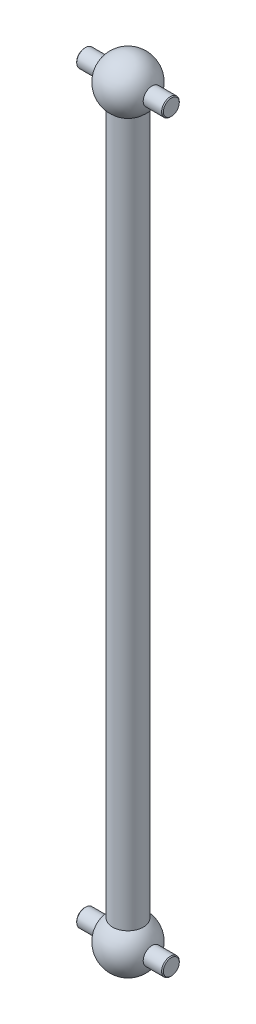
ISO-10303-21;
HEADER;
FILE_DESCRIPTION(('STEP AP214'),'2;1');
FILE_NAME('part.step','',(''),(''),'','','');
FILE_SCHEMA(('AUTOMOTIVE_DESIGN { 1 0 10303 214 1 1 1 1 }'));
ENDSEC;
DATA;
#1=APPLICATION_CONTEXT('core data for automotive mechanical design processes');
#2=APPLICATION_PROTOCOL_DEFINITION('international standard','automotive_design',2000,#1);
#3=PRODUCT_CONTEXT('',#1,'mechanical');
#4=PRODUCT('Part','Part','',(#3));
#5=PRODUCT_RELATED_PRODUCT_CATEGORY('part','',(#4));
#6=PRODUCT_DEFINITION_FORMATION('','',#4);
#7=PRODUCT_DEFINITION_CONTEXT('part definition',#1,'design');
#8=PRODUCT_DEFINITION('design','',#6,#7);
#9=PRODUCT_DEFINITION_SHAPE('','',#8);
#10=(LENGTH_UNIT() NAMED_UNIT(*) SI_UNIT(.MILLI.,.METRE.));
#11=(NAMED_UNIT(*) PLANE_ANGLE_UNIT() SI_UNIT($,.RADIAN.));
#12=(NAMED_UNIT(*) SI_UNIT($,.STERADIAN.) SOLID_ANGLE_UNIT());
#13=UNCERTAINTY_MEASURE_WITH_UNIT(LENGTH_MEASURE(1.E-05),#10,'distance_accuracy_value','');
#14=(GEOMETRIC_REPRESENTATION_CONTEXT(3) GLOBAL_UNCERTAINTY_ASSIGNED_CONTEXT((#13)) GLOBAL_UNIT_ASSIGNED_CONTEXT((#10,
#11,#12)) REPRESENTATION_CONTEXT('',''));
#15=CARTESIAN_POINT('',(0.,0.,0.));
#16=DIRECTION('',(0.,0.,1.));
#17=DIRECTION('',(1.,0.,0.));
#18=AXIS2_PLACEMENT_3D('',#15,#16,#17);
#19=CARTESIAN_POINT('',(0.,-42.1,0.));
#20=DIRECTION('',(0.,1.,0.));
#21=DIRECTION('',(-1.,0.,0.));
#22=AXIS2_PLACEMENT_3D('',#19,#20,#21);
#23=SPHERICAL_SURFACE('',#22,2.9);
#24=CARTESIAN_POINT('',(-2.72213151776324,-42.1,0.));
#25=DIRECTION('',(1.,0.,0.));
#26=DIRECTION('',(0.,0.,-1.));
#27=AXIS2_PLACEMENT_3D('',#24,#25,#26);
#28=CIRCLE('',#27,1.);
#29=CARTESIAN_POINT('',(-2.72213151776324,-42.1,-1.));
#30=VERTEX_POINT('',#29);
#31=EDGE_CURVE('E67',#30,#30,#28,.T.);
#32=ORIENTED_EDGE('',*,*,#31,.T.);
#33=EDGE_LOOP('',(#32));
#34=FACE_BOUND('',#33,.T.);
#35=CARTESIAN_POINT('',(0.,-39.7875337840306,0.));
#36=DIRECTION('',(0.,1.,0.));
#37=DIRECTION('',(0.,0.,1.));
#38=AXIS2_PLACEMENT_3D('',#35,#36,#37);
#39=CIRCLE('',#38,1.75);
#40=CARTESIAN_POINT('',(0.,-39.7875337840306,1.75));
#41=VERTEX_POINT('',#40);
#42=EDGE_CURVE('E66',#41,#41,#39,.T.);
#43=ORIENTED_EDGE('',*,*,#42,.F.);
#44=EDGE_LOOP('',(#43));
#45=FACE_BOUND('',#44,.T.);
#46=CARTESIAN_POINT('',(2.72213151776324,-42.1,0.));
#47=DIRECTION('',(-1.,0.,0.));
#48=DIRECTION('',(0.,0.,1.));
#49=AXIS2_PLACEMENT_3D('',#46,#47,#48);
#50=CIRCLE('',#49,1.);
#51=CARTESIAN_POINT('',(2.72213151776324,-42.1,1.));
#52=VERTEX_POINT('',#51);
#53=EDGE_CURVE('E63',#52,#52,#50,.T.);
#54=ORIENTED_EDGE('',*,*,#53,.T.);
#55=EDGE_LOOP('',(#54));
#56=FACE_BOUND('',#55,.T.);
#57=ADVANCED_FACE('F30',(#34,#45,#56),#23,.T.);
#58=CARTESIAN_POINT('',(0.,42.1,0.));
#59=DIRECTION('',(0.,1.,0.));
#60=DIRECTION('',(1.,0.,0.));
#61=AXIS2_PLACEMENT_3D('',#58,#59,#60);
#62=SPHERICAL_SURFACE('',#61,2.9);
#63=CARTESIAN_POINT('',(2.72213151776324,42.1,0.));
#64=DIRECTION('',(-1.,0.,0.));
#65=DIRECTION('',(0.,0.,1.));
#66=AXIS2_PLACEMENT_3D('',#63,#64,#65);
#67=CIRCLE('',#66,1.);
#68=CARTESIAN_POINT('',(2.72213151776324,42.1,1.));
#69=VERTEX_POINT('',#68);
#70=EDGE_CURVE('E62',#69,#69,#67,.F.);
#71=ORIENTED_EDGE('',*,*,#70,.F.);
#72=EDGE_LOOP('',(#71));
#73=FACE_BOUND('',#72,.T.);
#74=CARTESIAN_POINT('',(-2.72213151776324,42.1,0.));
#75=DIRECTION('',(1.,0.,0.));
#76=DIRECTION('',(0.,0.,-1.));
#77=AXIS2_PLACEMENT_3D('',#74,#75,#76);
#78=CIRCLE('',#77,1.);
#79=CARTESIAN_POINT('',(-2.72213151776324,42.1,-1.));
#80=VERTEX_POINT('',#79);
#81=EDGE_CURVE('E72',#80,#80,#78,.F.);
#82=ORIENTED_EDGE('',*,*,#81,.F.);
#83=EDGE_LOOP('',(#82));
#84=FACE_BOUND('',#83,.T.);
#85=CARTESIAN_POINT('',(0.,39.7875337840306,0.));
#86=DIRECTION('',(0.,1.,0.));
#87=DIRECTION('',(0.,0.,1.));
#88=AXIS2_PLACEMENT_3D('',#85,#86,#87);
#89=CIRCLE('',#88,1.75);
#90=CARTESIAN_POINT('',(0.,39.7875337840306,1.75));
#91=VERTEX_POINT('',#90);
#92=EDGE_CURVE('E75',#91,#91,#89,.T.);
#93=ORIENTED_EDGE('',*,*,#92,.T.);
#94=EDGE_LOOP('',(#93));
#95=FACE_BOUND('',#94,.T.);
#96=ADVANCED_FACE('F86',(#73,#84,#95),#62,.T.);
#97=CARTESIAN_POINT('',(0.,45.,0.));
#98=DIRECTION('',(0.,1.,0.));
#99=DIRECTION('',(0.,0.,1.));
#100=AXIS2_PLACEMENT_3D('',#97,#98,#99);
#101=CYLINDRICAL_SURFACE('',#100,1.75);
#102=ORIENTED_EDGE('',*,*,#42,.T.);
#103=EDGE_LOOP('',(#102));
#104=FACE_BOUND('',#103,.T.);
#105=ORIENTED_EDGE('',*,*,#92,.F.);
#106=EDGE_LOOP('',(#105));
#107=FACE_BOUND('',#106,.T.);
#108=ADVANCED_FACE('F81',(#104,#107),#101,.T.);
#109=CARTESIAN_POINT('',(-4.9,42.1,0.));
#110=DIRECTION('',(1.,0.,0.));
#111=DIRECTION('',(0.,0.,-1.));
#112=AXIS2_PLACEMENT_3D('',#109,#110,#111);
#113=PLANE('',#112);
#114=CARTESIAN_POINT('',(-4.9,42.1,0.));
#115=DIRECTION('',(1.,0.,0.));
#116=DIRECTION('',(0.,0.,-1.));
#117=AXIS2_PLACEMENT_3D('',#114,#115,#116);
#118=CIRCLE('',#117,0.899999999999998);
#119=CARTESIAN_POINT('',(-4.9,42.1,-0.899999999999998));
#120=VERTEX_POINT('',#119);
#121=EDGE_CURVE('E10',#120,#120,#118,.F.);
#122=ORIENTED_EDGE('',*,*,#121,.T.);
#123=EDGE_LOOP('',(#122));
#124=FACE_BOUND('',#123,.T.);
#125=ADVANCED_FACE('F113',(#124),#113,.F.);
#126=CARTESIAN_POINT('',(-4.9,42.1,0.));
#127=DIRECTION('',(1.,0.,0.));
#128=DIRECTION('',(0.,0.,-1.));
#129=AXIS2_PLACEMENT_3D('',#126,#127,#128);
#130=CYLINDRICAL_SURFACE('',#129,1.);
#131=CARTESIAN_POINT('',(-4.79999999999999,42.1,0.));
#132=DIRECTION('',(1.,0.,0.));
#133=DIRECTION('',(0.,0.,-1.));
#134=AXIS2_PLACEMENT_3D('',#131,#132,#133);
#135=CIRCLE('',#134,1.);
#136=CARTESIAN_POINT('',(-4.79999999999999,42.1,-1.));
#137=VERTEX_POINT('',#136);
#138=EDGE_CURVE('E37',#137,#137,#135,.T.);
#139=ORIENTED_EDGE('',*,*,#138,.T.);
#140=EDGE_LOOP('',(#139));
#141=FACE_BOUND('',#140,.T.);
#142=ORIENTED_EDGE('',*,*,#81,.T.);
#143=EDGE_LOOP('',(#142));
#144=FACE_BOUND('',#143,.T.);
#145=ADVANCED_FACE('F116',(#141,#144),#130,.T.);
#146=CARTESIAN_POINT('',(4.79999999999999,42.1,0.));
#147=DIRECTION('',(1.,0.,0.));
#148=DIRECTION('',(0.,0.,-1.));
#149=AXIS2_PLACEMENT_3D('',#146,#147,#148);
#150=CIRCLE('',#149,1.);
#151=CARTESIAN_POINT('',(4.79999999999999,42.1,-1.));
#152=VERTEX_POINT('',#151);
#153=EDGE_CURVE('E41',#152,#152,#150,.F.);
#154=ORIENTED_EDGE('',*,*,#153,.T.);
#155=EDGE_LOOP('',(#154));
#156=FACE_BOUND('',#155,.T.);
#157=ORIENTED_EDGE('',*,*,#70,.T.);
#158=EDGE_LOOP('',(#157));
#159=FACE_BOUND('',#158,.T.);
#160=ADVANCED_FACE('F111',(#156,#159),#130,.T.);
#161=CARTESIAN_POINT('',(4.9,42.1,0.));
#162=DIRECTION('',(1.,0.,0.));
#163=DIRECTION('',(0.,0.,-1.));
#164=AXIS2_PLACEMENT_3D('',#161,#162,#163);
#165=PLANE('',#164);
#166=CARTESIAN_POINT('',(4.9,42.1,0.));
#167=DIRECTION('',(1.,0.,0.));
#168=DIRECTION('',(0.,0.,-1.));
#169=AXIS2_PLACEMENT_3D('',#166,#167,#168);
#170=CIRCLE('',#169,0.899999999999998);
#171=CARTESIAN_POINT('',(4.9,42.1,-0.899999999999998));
#172=VERTEX_POINT('',#171);
#173=EDGE_CURVE('E45',#172,#172,#170,.T.);
#174=ORIENTED_EDGE('',*,*,#173,.T.);
#175=EDGE_LOOP('',(#174));
#176=FACE_BOUND('',#175,.T.);
#177=ADVANCED_FACE('F108',(#176),#165,.T.);
#178=CARTESIAN_POINT('',(-4.9,-42.1,0.));
#179=DIRECTION('',(1.,0.,0.));
#180=DIRECTION('',(0.,0.,-1.));
#181=AXIS2_PLACEMENT_3D('',#178,#179,#180);
#182=PLANE('',#181);
#183=CARTESIAN_POINT('',(-4.9,-42.1,0.));
#184=DIRECTION('',(1.,0.,0.));
#185=DIRECTION('',(0.,0.,-1.));
#186=AXIS2_PLACEMENT_3D('',#183,#184,#185);
#187=CIRCLE('',#186,0.899999999999998);
#188=CARTESIAN_POINT('',(-4.9,-42.1,-0.899999999999998));
#189=VERTEX_POINT('',#188);
#190=EDGE_CURVE('E53',#189,#189,#187,.F.);
#191=ORIENTED_EDGE('',*,*,#190,.T.);
#192=EDGE_LOOP('',(#191));
#193=FACE_BOUND('',#192,.T.);
#194=ADVANCED_FACE('F104',(#193),#182,.F.);
#195=CARTESIAN_POINT('',(-4.9,-42.1,0.));
#196=DIRECTION('',(1.,0.,0.));
#197=DIRECTION('',(0.,0.,-1.));
#198=AXIS2_PLACEMENT_3D('',#195,#196,#197);
#199=CYLINDRICAL_SURFACE('',#198,1.);
#200=CARTESIAN_POINT('',(-4.79999999999999,-42.1,0.));
#201=DIRECTION('',(1.,0.,0.));
#202=DIRECTION('',(0.,0.,-1.));
#203=AXIS2_PLACEMENT_3D('',#200,#201,#202);
#204=CIRCLE('',#203,1.);
#205=CARTESIAN_POINT('',(-4.79999999999999,-42.1,-1.));
#206=VERTEX_POINT('',#205);
#207=EDGE_CURVE('E50',#206,#206,#204,.T.);
#208=ORIENTED_EDGE('',*,*,#207,.T.);
#209=EDGE_LOOP('',(#208));
#210=FACE_BOUND('',#209,.T.);
#211=ORIENTED_EDGE('',*,*,#31,.F.);
#212=EDGE_LOOP('',(#211));
#213=FACE_BOUND('',#212,.T.);
#214=ADVANCED_FACE('F94',(#210,#213),#199,.T.);
#215=CARTESIAN_POINT('',(4.80000000000001,-42.1,0.));
#216=DIRECTION('',(1.,0.,0.));
#217=DIRECTION('',(0.,0.,-1.));
#218=AXIS2_PLACEMENT_3D('',#215,#216,#217);
#219=CIRCLE('',#218,1.);
#220=CARTESIAN_POINT('',(4.80000000000001,-42.1,1.));
#221=VERTEX_POINT('',#220);
#222=EDGE_CURVE('E59',#221,#221,#219,.F.);
#223=ORIENTED_EDGE('',*,*,#222,.T.);
#224=EDGE_LOOP('',(#223));
#225=FACE_BOUND('',#224,.T.);
#226=ORIENTED_EDGE('',*,*,#53,.F.);
#227=EDGE_LOOP('',(#226));
#228=FACE_BOUND('',#227,.T.);
#229=ADVANCED_FACE('F91',(#225,#228),#199,.T.);
#230=CARTESIAN_POINT('',(4.9,-42.1,0.));
#231=DIRECTION('',(1.,0.,0.));
#232=DIRECTION('',(0.,0.,-1.));
#233=AXIS2_PLACEMENT_3D('',#230,#231,#232);
#234=PLANE('',#233);
#235=CARTESIAN_POINT('',(4.9,-42.1,0.));
#236=DIRECTION('',(1.,0.,0.));
#237=DIRECTION('',(0.,0.,-1.));
#238=AXIS2_PLACEMENT_3D('',#235,#236,#237);
#239=CIRCLE('',#238,0.900000000000012);
#240=CARTESIAN_POINT('',(4.9,-42.1,0.900000000000012));
#241=VERTEX_POINT('',#240);
#242=EDGE_CURVE('E56',#241,#241,#239,.T.);
#243=ORIENTED_EDGE('',*,*,#242,.T.);
#244=EDGE_LOOP('',(#243));
#245=FACE_BOUND('',#244,.T.);
#246=ADVANCED_FACE('F93',(#245),#234,.T.);
#247=CARTESIAN_POINT('',(4.80000000000001,-42.1,0.));
#248=DIRECTION('',(-1.,0.,0.));
#249=DIRECTION('',(0.,0.,1.));
#250=AXIS2_PLACEMENT_3D('',#247,#248,#249);
#251=CONICAL_SURFACE('',#250,1.,0.78539816339743);
#252=CARTESIAN_POINT('',(4.9,-42.1,0.900000000000012));
#253=CARTESIAN_POINT('',(4.89895833333333,-42.1,0.901041666666679));
#254=CARTESIAN_POINT('',(4.89791666666667,-42.1,0.902083333333345));
#255=CARTESIAN_POINT('',(4.89583333333333,-42.1,0.904166666666679));
#256=CARTESIAN_POINT('',(4.89479166666667,-42.1,0.905208333333345));
#257=CARTESIAN_POINT('',(4.89270833333333,-42.1,0.907291666666678));
#258=CARTESIAN_POINT('',(4.89166666666667,-42.1,0.908333333333345));
#259=CARTESIAN_POINT('',(4.88958333333333,-42.1,0.910416666666678));
#260=CARTESIAN_POINT('',(4.88854166666667,-42.1,0.911458333333344));
#261=CARTESIAN_POINT('',(4.88645833333333,-42.1,0.913541666666678));
#262=CARTESIAN_POINT('',(4.88541666666667,-42.1,0.914583333333344));
#263=CARTESIAN_POINT('',(4.88333333333333,-42.1,0.916666666666678));
#264=CARTESIAN_POINT('',(4.88229166666667,-42.1,0.917708333333344));
#265=CARTESIAN_POINT('',(4.88020833333333,-42.1,0.919791666666677));
#266=CARTESIAN_POINT('',(4.87916666666667,-42.1,0.920833333333344));
#267=CARTESIAN_POINT('',(4.87708333333333,-42.1,0.922916666666677));
#268=CARTESIAN_POINT('',(4.87604166666667,-42.1,0.923958333333343));
#269=CARTESIAN_POINT('',(4.87395833333334,-42.1,0.926041666666676));
#270=CARTESIAN_POINT('',(4.87291666666667,-42.1,0.927083333333343));
#271=CARTESIAN_POINT('',(4.87083333333334,-42.1,0.929166666666676));
#272=CARTESIAN_POINT('',(4.86979166666667,-42.1,0.930208333333343));
#273=CARTESIAN_POINT('',(4.86770833333334,-42.1,0.932291666666676));
#274=CARTESIAN_POINT('',(4.86666666666667,-42.1,0.933333333333342));
#275=CARTESIAN_POINT('',(4.86458333333334,-42.1,0.935416666666675));
#276=CARTESIAN_POINT('',(4.86354166666667,-42.1,0.936458333333342));
#277=CARTESIAN_POINT('',(4.86145833333334,-42.1,0.938541666666675));
#278=CARTESIAN_POINT('',(4.86041666666667,-42.1,0.939583333333342));
#279=CARTESIAN_POINT('',(4.85833333333334,-42.1,0.941666666666675));
#280=CARTESIAN_POINT('',(4.85729166666667,-42.1,0.942708333333342));
#281=CARTESIAN_POINT('',(4.85520833333334,-42.1,0.944791666666675));
#282=CARTESIAN_POINT('',(4.85416666666667,-42.1,0.945833333333341));
#283=CARTESIAN_POINT('',(4.85208333333334,-42.1,0.947916666666675));
#284=CARTESIAN_POINT('',(4.85104166666667,-42.1,0.948958333333341));
#285=CARTESIAN_POINT('',(4.84895833333334,-42.1,0.951041666666674));
#286=CARTESIAN_POINT('',(4.84791666666667,-42.1,0.952083333333341));
#287=CARTESIAN_POINT('',(4.84583333333334,-42.1,0.954166666666674));
#288=CARTESIAN_POINT('',(4.84479166666667,-42.1,0.95520833333334));
#289=CARTESIAN_POINT('',(4.84270833333334,-42.1,0.957291666666674));
#290=CARTESIAN_POINT('',(4.84166666666667,-42.1,0.95833333333334));
#291=CARTESIAN_POINT('',(4.83958333333334,-42.1,0.960416666666673));
#292=CARTESIAN_POINT('',(4.83854166666667,-42.1,0.96145833333334));
#293=CARTESIAN_POINT('',(4.83645833333334,-42.1,0.963541666666673));
#294=CARTESIAN_POINT('',(4.83541666666667,-42.1,0.96458333333334));
#295=CARTESIAN_POINT('',(4.83333333333334,-42.1,0.966666666666673));
#296=CARTESIAN_POINT('',(4.83229166666667,-42.1,0.967708333333339));
#297=CARTESIAN_POINT('',(4.83020833333334,-42.1,0.969791666666672));
#298=CARTESIAN_POINT('',(4.82916666666667,-42.1,0.970833333333339));
#299=CARTESIAN_POINT('',(4.82708333333334,-42.1,0.972916666666672));
#300=CARTESIAN_POINT('',(4.82604166666667,-42.1,0.973958333333339));
#301=CARTESIAN_POINT('',(4.82395833333334,-42.1,0.976041666666672));
#302=CARTESIAN_POINT('',(4.82291666666667,-42.1,0.977083333333338));
#303=CARTESIAN_POINT('',(4.82083333333334,-42.1,0.979166666666671));
#304=CARTESIAN_POINT('',(4.81979166666667,-42.1,0.980208333333338));
#305=CARTESIAN_POINT('',(4.81770833333334,-42.1,0.982291666666671));
#306=CARTESIAN_POINT('',(4.81666666666667,-42.1,0.983333333333338));
#307=CARTESIAN_POINT('',(4.81458333333334,-42.1,0.985416666666671));
#308=CARTESIAN_POINT('',(4.81354166666667,-42.1,0.986458333333337));
#309=CARTESIAN_POINT('',(4.81145833333334,-42.1,0.988541666666671));
#310=CARTESIAN_POINT('',(4.81041666666667,-42.1,0.989583333333337));
#311=CARTESIAN_POINT('',(4.80833333333334,-42.1,0.99166666666667));
#312=CARTESIAN_POINT('',(4.80729166666667,-42.1,0.992708333333337));
#313=CARTESIAN_POINT('',(4.80520833333334,-42.1,0.99479166666667));
#314=CARTESIAN_POINT('',(4.80416666666667,-42.1,0.995833333333337));
#315=CARTESIAN_POINT('',(4.80208333333334,-42.1,0.99791666666667));
#316=CARTESIAN_POINT('',(4.80104166666667,-42.1,0.998958333333336));
#317=CARTESIAN_POINT('',(4.80000000000001,-42.1,1.));
#318=B_SPLINE_CURVE_WITH_KNOTS('',3,(#252,#253,#254,#255,#256,#257,#258,#259,#260,#261,#262,
#263,#264,#265,#266,#267,#268,#269,#270,#271,#272,#273,#274,#275,#276,#277,#278,#279,#280,#281,
#282,#283,#284,#285,#286,#287,#288,#289,#290,#291,#292,#293,#294,#295,#296,#297,#298,#299,#300,
#301,#302,#303,#304,#305,#306,#307,#308,#309,#310,#311,#312,#313,#314,#315,#316,#317),
.UNSPECIFIED.,.F.,.F.,(4,2,2,2,2,2,2,2,2,2,2,2,2,2,2,2,2,2,2,2,2,2,2,2,2,2,2,2,2,2,2,2,4),(0.,
0.00441941738241605,0.00883883476483148,0.013258252147247,0.0176776695296624,0.0220970869120779,
0.026516504294494,0.0309359216769095,0.0353553390593249,0.0397747564417405,0.0441941738241559,
0.0486135912065719,0.0530330085889874,0.057452425971403,0.0618718433538184,0.0662912607362338,
0.0707106781186494,0.0751300955010654,0.0795495128834809,0.0839689302658963,0.0883883476483119,
0.0928077650307273,0.0972271824131433,0.101646599795559,0.106066017177974,0.11048543456039,
0.114904851942805,0.119324269325221,0.123743686707637,0.128163104090052,0.132582521472468,
0.137001938854883,0.141421356237299),.UNSPECIFIED.);
#319=EDGE_CURVE('BSEAM101',#241,#221,#318,.T.);
#320=ORIENTED_EDGE('',*,*,#242,.F.);
#321=ORIENTED_EDGE('',*,*,#222,.F.);
#322=ORIENTED_EDGE('',*,*,#319,.T.);
#323=ORIENTED_EDGE('',*,*,#319,.F.);
#324=EDGE_LOOP('',(#320,#322,#321,#323));
#325=FACE_BOUND('',#324,.T.);
#326=ADVANCED_FACE('F101',(#325),#251,.T.);
#327=CARTESIAN_POINT('',(-4.9,-42.1,0.));
#328=DIRECTION('',(1.,0.,0.));
#329=DIRECTION('',(0.,0.,-1.));
#330=AXIS2_PLACEMENT_3D('',#327,#328,#329);
#331=CONICAL_SURFACE('',#330,0.899999999999998,0.785398163397421);
#332=ORIENTED_EDGE('',*,*,#207,.F.);
#333=EDGE_LOOP('',(#332));
#334=FACE_BOUND('',#333,.T.);
#335=ORIENTED_EDGE('',*,*,#190,.F.);
#336=EDGE_LOOP('',(#335));
#337=FACE_BOUND('',#336,.T.);
#338=ADVANCED_FACE('F126',(#334,#337),#331,.T.);
#339=CARTESIAN_POINT('',(4.9,42.1,0.));
#340=DIRECTION('',(-1.,0.,0.));
#341=DIRECTION('',(0.,0.,1.));
#342=AXIS2_PLACEMENT_3D('',#339,#340,#341);
#343=CONICAL_SURFACE('',#342,0.899999999999998,0.785398163397421);
#344=ORIENTED_EDGE('',*,*,#153,.F.);
#345=EDGE_LOOP('',(#344));
#346=FACE_BOUND('',#345,.T.);
#347=ORIENTED_EDGE('',*,*,#173,.F.);
#348=EDGE_LOOP('',(#347));
#349=FACE_BOUND('',#348,.T.);
#350=ADVANCED_FACE('F129',(#346,#349),#343,.T.);
#351=CARTESIAN_POINT('',(-4.79999999999999,42.1,0.));
#352=DIRECTION('',(1.,0.,0.));
#353=DIRECTION('',(0.,0.,-1.));
#354=AXIS2_PLACEMENT_3D('',#351,#352,#353);
#355=CONICAL_SURFACE('',#354,1.,0.78539816339743);
#356=CARTESIAN_POINT('',(-4.9,42.1,-0.899999999999998));
#357=CARTESIAN_POINT('',(-4.89895833333333,42.1,-0.901041666666664));
#358=CARTESIAN_POINT('',(-4.89791666666667,42.1,-0.902083333333331));
#359=CARTESIAN_POINT('',(-4.89583333333333,42.1,-0.904166666666664));
#360=CARTESIAN_POINT('',(-4.89479166666667,42.1,-0.905208333333331));
#361=CARTESIAN_POINT('',(-4.89270833333333,42.1,-0.907291666666664));
#362=CARTESIAN_POINT('',(-4.89166666666667,42.1,-0.908333333333331));
#363=CARTESIAN_POINT('',(-4.88958333333333,42.1,-0.910416666666665));
#364=CARTESIAN_POINT('',(-4.88854166666667,42.1,-0.911458333333331));
#365=CARTESIAN_POINT('',(-4.88645833333333,42.1,-0.913541666666665));
#366=CARTESIAN_POINT('',(-4.88541666666667,42.1,-0.914583333333332));
#367=CARTESIAN_POINT('',(-4.88333333333333,42.1,-0.916666666666665));
#368=CARTESIAN_POINT('',(-4.88229166666667,42.1,-0.917708333333332));
#369=CARTESIAN_POINT('',(-4.88020833333333,42.1,-0.919791666666665));
#370=CARTESIAN_POINT('',(-4.87916666666667,42.1,-0.920833333333332));
#371=CARTESIAN_POINT('',(-4.87708333333333,42.1,-0.922916666666665));
#372=CARTESIAN_POINT('',(-4.87604166666667,42.1,-0.923958333333332));
#373=CARTESIAN_POINT('',(-4.87395833333333,42.1,-0.926041666666665));
#374=CARTESIAN_POINT('',(-4.87291666666667,42.1,-0.927083333333332));
#375=CARTESIAN_POINT('',(-4.87083333333333,42.1,-0.929166666666665));
#376=CARTESIAN_POINT('',(-4.86979166666667,42.1,-0.930208333333332));
#377=CARTESIAN_POINT('',(-4.86770833333333,42.1,-0.932291666666666));
#378=CARTESIAN_POINT('',(-4.86666666666667,42.1,-0.933333333333332));
#379=CARTESIAN_POINT('',(-4.86458333333333,42.1,-0.935416666666666));
#380=CARTESIAN_POINT('',(-4.86354166666666,42.1,-0.936458333333332));
#381=CARTESIAN_POINT('',(-4.86145833333333,42.1,-0.938541666666666));
#382=CARTESIAN_POINT('',(-4.86041666666666,42.1,-0.939583333333333));
#383=CARTESIAN_POINT('',(-4.85833333333333,42.1,-0.941666666666666));
#384=CARTESIAN_POINT('',(-4.85729166666666,42.1,-0.942708333333333));
#385=CARTESIAN_POINT('',(-4.85520833333333,42.1,-0.944791666666666));
#386=CARTESIAN_POINT('',(-4.85416666666666,42.1,-0.945833333333333));
#387=CARTESIAN_POINT('',(-4.85208333333333,42.1,-0.947916666666666));
#388=CARTESIAN_POINT('',(-4.85104166666666,42.1,-0.948958333333333));
#389=CARTESIAN_POINT('',(-4.84895833333333,42.1,-0.951041666666666));
#390=CARTESIAN_POINT('',(-4.84791666666666,42.1,-0.952083333333333));
#391=CARTESIAN_POINT('',(-4.84583333333333,42.1,-0.954166666666667));
#392=CARTESIAN_POINT('',(-4.84479166666666,42.1,-0.955208333333333));
#393=CARTESIAN_POINT('',(-4.84270833333333,42.1,-0.957291666666667));
#394=CARTESIAN_POINT('',(-4.84166666666666,42.1,-0.958333333333333));
#395=CARTESIAN_POINT('',(-4.83958333333333,42.1,-0.960416666666667));
#396=CARTESIAN_POINT('',(-4.83854166666666,42.1,-0.961458333333334));
#397=CARTESIAN_POINT('',(-4.83645833333333,42.1,-0.963541666666667));
#398=CARTESIAN_POINT('',(-4.83541666666666,42.1,-0.964583333333334));
#399=CARTESIAN_POINT('',(-4.83333333333333,42.1,-0.966666666666667));
#400=CARTESIAN_POINT('',(-4.83229166666666,42.1,-0.967708333333334));
#401=CARTESIAN_POINT('',(-4.83020833333333,42.1,-0.969791666666667));
#402=CARTESIAN_POINT('',(-4.82916666666666,42.1,-0.970833333333334));
#403=CARTESIAN_POINT('',(-4.82708333333333,42.1,-0.972916666666668));
#404=CARTESIAN_POINT('',(-4.82604166666666,42.1,-0.973958333333334));
#405=CARTESIAN_POINT('',(-4.82395833333333,42.1,-0.976041666666667));
#406=CARTESIAN_POINT('',(-4.82291666666666,42.1,-0.977083333333334));
#407=CARTESIAN_POINT('',(-4.82083333333333,42.1,-0.979166666666668));
#408=CARTESIAN_POINT('',(-4.81979166666666,42.1,-0.980208333333334));
#409=CARTESIAN_POINT('',(-4.81770833333333,42.1,-0.982291666666668));
#410=CARTESIAN_POINT('',(-4.81666666666666,42.1,-0.983333333333335));
#411=CARTESIAN_POINT('',(-4.81458333333333,42.1,-0.985416666666668));
#412=CARTESIAN_POINT('',(-4.81354166666666,42.1,-0.986458333333335));
#413=CARTESIAN_POINT('',(-4.81145833333333,42.1,-0.988541666666668));
#414=CARTESIAN_POINT('',(-4.81041666666666,42.1,-0.989583333333335));
#415=CARTESIAN_POINT('',(-4.80833333333333,42.1,-0.991666666666668));
#416=CARTESIAN_POINT('',(-4.80729166666666,42.1,-0.992708333333335));
#417=CARTESIAN_POINT('',(-4.80520833333333,42.1,-0.994791666666669));
#418=CARTESIAN_POINT('',(-4.80416666666666,42.1,-0.995833333333335));
#419=CARTESIAN_POINT('',(-4.80208333333333,42.1,-0.997916666666669));
#420=CARTESIAN_POINT('',(-4.80104166666666,42.1,-0.998958333333335));
#421=CARTESIAN_POINT('',(-4.79999999999999,42.1,-1.));
#422=B_SPLINE_CURVE_WITH_KNOTS('',3,(#356,#357,#358,#359,#360,#361,#362,#363,#364,#365,#366,
#367,#368,#369,#370,#371,#372,#373,#374,#375,#376,#377,#378,#379,#380,#381,#382,#383,#384,#385,
#386,#387,#388,#389,#390,#391,#392,#393,#394,#395,#396,#397,#398,#399,#400,#401,#402,#403,#404,
#405,#406,#407,#408,#409,#410,#411,#412,#413,#414,#415,#416,#417,#418,#419,#420,#421),
.UNSPECIFIED.,.F.,.F.,(4,2,2,2,2,2,2,2,2,2,2,2,2,2,2,2,2,2,2,2,2,2,2,2,2,2,2,2,2,2,2,2,4),(0.,
0.00441941738241574,0.00883883476483218,0.0132582521472485,0.0176776695296644,
0.0220970869120807,0.0265165042944971,0.0309359216769129,0.0353553390593293,0.0397747564417457,
0.0441941738241614,0.0486135912065778,0.0530330085889942,0.05745242597141,0.0618718433538264,
0.0662912607362428,0.0707106781186592,0.0751300955010749,0.0795495128834913,0.0839689302659077,
0.0883883476483235,0.0928077650307399,0.0972271824131563,0.101646599795572,0.106066017177988,
0.110485434560405,0.114904851942821,0.119324269325237,0.123743686707653,0.128163104090069,
0.132582521472486,0.137001938854902,0.141421356237318),.UNSPECIFIED.);
#423=EDGE_CURVE('BSEAM32',#120,#137,#422,.T.);
#424=ORIENTED_EDGE('',*,*,#121,.F.);
#425=ORIENTED_EDGE('',*,*,#138,.F.);
#426=ORIENTED_EDGE('',*,*,#423,.T.);
#427=ORIENTED_EDGE('',*,*,#423,.F.);
#428=EDGE_LOOP('',(#424,#426,#425,#427));
#429=FACE_BOUND('',#428,.T.);
#430=ADVANCED_FACE('F32',(#429),#355,.T.);
#431=CLOSED_SHELL('',(#57,#96,#108,#125,#145,#160,#177,#194,#214,#229,#246,#326,#338,#350,#430));
#432=MANIFOLD_SOLID_BREP('B2',#431);
#433=ADVANCED_BREP_SHAPE_REPRESENTATION('',(#18,#432),#14);
#434=SHAPE_DEFINITION_REPRESENTATION(#9,#433);
ENDSEC;
END-ISO-10303-21;
